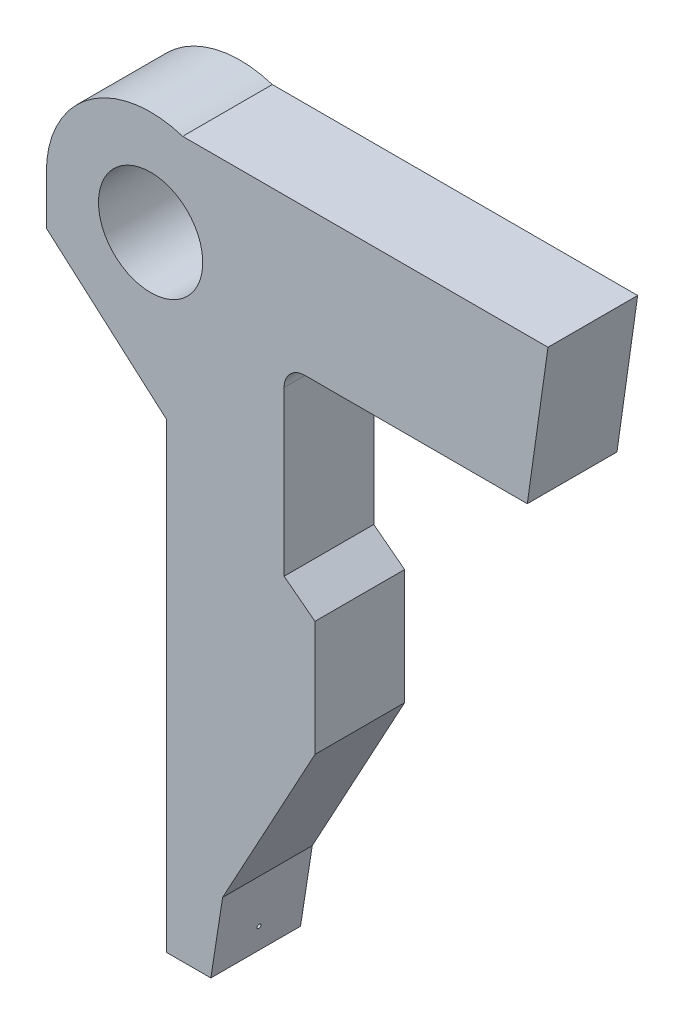
ISO-10303-21;
HEADER;
FILE_DESCRIPTION(('STEP AP214'),'2;1');
FILE_NAME('part.step','',(''),(''),'','','');
FILE_SCHEMA(('AUTOMOTIVE_DESIGN { 1 0 10303 214 1 1 1 1 }'));
ENDSEC;
DATA;
#1=APPLICATION_CONTEXT('core data for automotive mechanical design processes');
#2=APPLICATION_PROTOCOL_DEFINITION('international standard','automotive_design',2000,#1);
#3=PRODUCT_CONTEXT('',#1,'mechanical');
#4=PRODUCT('Part','Part','',(#3));
#5=PRODUCT_RELATED_PRODUCT_CATEGORY('part','',(#4));
#6=PRODUCT_DEFINITION_FORMATION('','',#4);
#7=PRODUCT_DEFINITION_CONTEXT('part definition',#1,'design');
#8=PRODUCT_DEFINITION('design','',#6,#7);
#9=PRODUCT_DEFINITION_SHAPE('','',#8);
#10=(LENGTH_UNIT() NAMED_UNIT(*) SI_UNIT(.MILLI.,.METRE.));
#11=(NAMED_UNIT(*) PLANE_ANGLE_UNIT() SI_UNIT($,.RADIAN.));
#12=(NAMED_UNIT(*) SI_UNIT($,.STERADIAN.) SOLID_ANGLE_UNIT());
#13=UNCERTAINTY_MEASURE_WITH_UNIT(LENGTH_MEASURE(1.E-05),#10,'distance_accuracy_value','');
#14=(GEOMETRIC_REPRESENTATION_CONTEXT(3) GLOBAL_UNCERTAINTY_ASSIGNED_CONTEXT((#13)) GLOBAL_UNIT_ASSIGNED_CONTEXT((#10,
#11,#12)) REPRESENTATION_CONTEXT('',''));
#15=CARTESIAN_POINT('',(0.,0.,0.));
#16=DIRECTION('',(0.,0.,1.));
#17=DIRECTION('',(1.,0.,0.));
#18=AXIS2_PLACEMENT_3D('',#15,#16,#17);
#19=CARTESIAN_POINT('',(6.40208237027269,0.,4.3));
#20=DIRECTION('',(-1.,0.,0.));
#21=DIRECTION('',(0.,-1.,0.));
#22=AXIS2_PLACEMENT_3D('',#19,#20,#21);
#23=PLANE('',#22);
#24=DIRECTION('',(0.,1.,0.));
#25=VECTOR('',#24,1.);
#26=CARTESIAN_POINT('',(6.40208237027269,0.,0.));
#27=LINE('',#26,#25);
#28=CARTESIAN_POINT('',(6.40208237027269,-11.0792552576076,0.));
#29=VERTEX_POINT('',#28);
#30=CARTESIAN_POINT('',(6.40208237027269,-3.2376102121532,0.));
#31=VERTEX_POINT('',#30);
#32=EDGE_CURVE('E171',#29,#31,#27,.T.);
#33=ORIENTED_EDGE('',*,*,#32,.T.);
#34=DIRECTION('',(0.,0.,-1.));
#35=VECTOR('',#34,1.);
#36=CARTESIAN_POINT('',(6.40208237027269,-3.2376102121532,4.3));
#37=LINE('',#36,#35);
#38=CARTESIAN_POINT('',(6.40208237027269,-3.2376102121532,4.3));
#39=VERTEX_POINT('',#38);
#40=EDGE_CURVE('E11',#39,#31,#37,.T.);
#41=ORIENTED_EDGE('',*,*,#40,.F.);
#42=DIRECTION('',(0.,1.,0.));
#43=VECTOR('',#42,1.);
#44=CARTESIAN_POINT('',(6.40208237027269,0.,4.3));
#45=LINE('',#44,#43);
#46=CARTESIAN_POINT('',(6.40208237027269,-11.0792552576076,4.3));
#47=VERTEX_POINT('',#46);
#48=EDGE_CURVE('E201',#47,#39,#45,.T.);
#49=ORIENTED_EDGE('',*,*,#48,.F.);
#50=DIRECTION('',(0.,0.,-1.));
#51=VECTOR('',#50,1.);
#52=CARTESIAN_POINT('',(6.40208237027269,-11.0792552576076,4.3));
#53=LINE('',#52,#51);
#54=EDGE_CURVE('E170',#47,#29,#53,.T.);
#55=ORIENTED_EDGE('',*,*,#54,.T.);
#56=EDGE_LOOP('',(#33,#41,#49,#55));
#57=FACE_BOUND('',#56,.T.);
#58=ADVANCED_FACE('F35',(#57),#23,.F.);
#59=CARTESIAN_POINT('',(7.40208237027269,-3.2376102121532,4.3));
#60=DIRECTION('',(0.,0.,-1.));
#61=DIRECTION('',(-1.,0.,0.));
#62=AXIS2_PLACEMENT_3D('',#59,#60,#61);
#63=CYLINDRICAL_SURFACE('',#62,0.999999999999999);
#64=CARTESIAN_POINT('',(7.40208237027269,-3.2376102121532,0.));
#65=DIRECTION('',(0.,0.,1.));
#66=DIRECTION('',(1.,0.,0.));
#67=AXIS2_PLACEMENT_3D('',#64,#65,#66);
#68=CIRCLE('',#67,0.999999999999999);
#69=CARTESIAN_POINT('',(7.40208237027269,-2.2376102121532,0.));
#70=VERTEX_POINT('',#69);
#71=EDGE_CURVE('E174',#31,#70,#68,.F.);
#72=ORIENTED_EDGE('',*,*,#71,.T.);
#73=DIRECTION('',(0.,0.,-1.));
#74=VECTOR('',#73,1.);
#75=CARTESIAN_POINT('',(7.40208237027269,-2.2376102121532,4.3));
#76=LINE('',#75,#74);
#77=CARTESIAN_POINT('',(7.40208237027269,-2.2376102121532,4.3));
#78=VERTEX_POINT('',#77);
#79=EDGE_CURVE('E43',#78,#70,#76,.T.);
#80=ORIENTED_EDGE('',*,*,#79,.F.);
#81=CARTESIAN_POINT('',(7.40208237027269,-3.2376102121532,4.3));
#82=DIRECTION('',(0.,0.,1.));
#83=DIRECTION('',(1.,0.,0.));
#84=AXIS2_PLACEMENT_3D('',#81,#82,#83);
#85=CIRCLE('',#84,0.999999999999999);
#86=EDGE_CURVE('E112',#39,#78,#85,.F.);
#87=ORIENTED_EDGE('',*,*,#86,.F.);
#88=ORIENTED_EDGE('',*,*,#40,.T.);
#89=EDGE_LOOP('',(#72,#80,#87,#88));
#90=FACE_BOUND('',#89,.T.);
#91=ADVANCED_FACE('F291',(#90),#63,.F.);
#92=CARTESIAN_POINT('',(0.,-2.2376102121532,4.3));
#93=DIRECTION('',(0.,1.,0.));
#94=DIRECTION('',(-1.,0.,0.));
#95=AXIS2_PLACEMENT_3D('',#92,#93,#94);
#96=PLANE('',#95);
#97=DIRECTION('',(1.,0.,0.));
#98=VECTOR('',#97,1.);
#99=CARTESIAN_POINT('',(0.,-2.2376102121532,0.));
#100=LINE('',#99,#98);
#101=CARTESIAN_POINT('',(18.063612226188,-2.2376102121532,0.));
#102=VERTEX_POINT('',#101);
#103=EDGE_CURVE('E177',#70,#102,#100,.T.);
#104=ORIENTED_EDGE('',*,*,#103,.T.);
#105=DIRECTION('',(0.,0.,-1.));
#106=VECTOR('',#105,1.);
#107=CARTESIAN_POINT('',(18.063612226188,-2.2376102121532,4.3));
#108=LINE('',#107,#106);
#109=CARTESIAN_POINT('',(18.063612226188,-2.2376102121532,4.3));
#110=VERTEX_POINT('',#109);
#111=EDGE_CURVE('E226',#110,#102,#108,.T.);
#112=ORIENTED_EDGE('',*,*,#111,.F.);
#113=DIRECTION('',(1.,0.,0.));
#114=VECTOR('',#113,1.);
#115=CARTESIAN_POINT('',(0.,-2.2376102121532,4.3));
#116=LINE('',#115,#114);
#117=EDGE_CURVE('E234',#78,#110,#116,.T.);
#118=ORIENTED_EDGE('',*,*,#117,.F.);
#119=ORIENTED_EDGE('',*,*,#79,.T.);
#120=EDGE_LOOP('',(#104,#112,#118,#119));
#121=FACE_BOUND('',#120,.T.);
#122=ADVANCED_FACE('F232',(#121),#96,.F.);
#123=CARTESIAN_POINT('',(18.0184346235268,-2.55607840833381,4.3));
#124=DIRECTION('',(-0.990087364863809,0.140452874434947,0.));
#125=DIRECTION('',(-0.140452874434947,-0.990087364863809,0.));
#126=AXIS2_PLACEMENT_3D('',#123,#124,#125);
#127=PLANE('',#126);
#128=DIRECTION('',(0.140452874434947,0.990087364863809,0.));
#129=VECTOR('',#128,1.);
#130=CARTESIAN_POINT('',(18.0184346235268,-2.55607840833381,0.));
#131=LINE('',#130,#129);
#132=CARTESIAN_POINT('',(19.0560025989645,4.7579971974597,0.));
#133=VERTEX_POINT('',#132);
#134=EDGE_CURVE('E179',#102,#133,#131,.T.);
#135=ORIENTED_EDGE('',*,*,#134,.T.);
#136=DIRECTION('',(0.,0.,-1.));
#137=VECTOR('',#136,1.);
#138=CARTESIAN_POINT('',(19.0560025989645,4.7579971974597,4.3));
#139=LINE('',#138,#137);
#140=CARTESIAN_POINT('',(19.0560025989645,4.7579971974597,4.3));
#141=VERTEX_POINT('',#140);
#142=EDGE_CURVE('E223',#141,#133,#139,.T.);
#143=ORIENTED_EDGE('',*,*,#142,.F.);
#144=DIRECTION('',(0.140452874434947,0.990087364863809,0.));
#145=VECTOR('',#144,1.);
#146=CARTESIAN_POINT('',(18.0184346235268,-2.55607840833381,4.3));
#147=LINE('',#146,#145);
#148=EDGE_CURVE('E253',#110,#141,#147,.T.);
#149=ORIENTED_EDGE('',*,*,#148,.F.);
#150=ORIENTED_EDGE('',*,*,#111,.T.);
#151=EDGE_LOOP('',(#135,#143,#149,#150));
#152=FACE_BOUND('',#151,.T.);
#153=ADVANCED_FACE('F244',(#152),#127,.F.);
#154=CARTESIAN_POINT('',(0.,4.7579971974597,4.3));
#155=DIRECTION('',(0.,-1.,0.));
#156=DIRECTION('',(0.,0.,-1.));
#157=AXIS2_PLACEMENT_3D('',#154,#155,#156);
#158=PLANE('',#157);
#159=DIRECTION('',(-1.,0.,0.));
#160=VECTOR('',#159,1.);
#161=CARTESIAN_POINT('',(0.,4.7579971974597,0.));
#162=LINE('',#161,#160);
#163=CARTESIAN_POINT('',(1.53670513403374,4.7579971974597,0.));
#164=VERTEX_POINT('',#163);
#165=EDGE_CURVE('E181',#133,#164,#162,.T.);
#166=ORIENTED_EDGE('',*,*,#165,.T.);
#167=DIRECTION('',(0.,0.,-1.));
#168=VECTOR('',#167,1.);
#169=CARTESIAN_POINT('',(1.53670513403374,4.7579971974597,4.3));
#170=LINE('',#169,#168);
#171=CARTESIAN_POINT('',(1.53670513403374,4.7579971974597,4.3));
#172=VERTEX_POINT('',#171);
#173=EDGE_CURVE('E220',#172,#164,#170,.T.);
#174=ORIENTED_EDGE('',*,*,#173,.F.);
#175=DIRECTION('',(-1.,0.,0.));
#176=VECTOR('',#175,1.);
#177=CARTESIAN_POINT('',(0.,4.7579971974597,4.3));
#178=LINE('',#177,#176);
#179=EDGE_CURVE('E250',#141,#172,#178,.T.);
#180=ORIENTED_EDGE('',*,*,#179,.F.);
#181=ORIENTED_EDGE('',*,*,#142,.T.);
#182=EDGE_LOOP('',(#166,#174,#180,#181));
#183=FACE_BOUND('',#182,.T.);
#184=ADVANCED_FACE('F248',(#183),#158,.F.);
#185=CARTESIAN_POINT('',(0.,0.,4.3));
#186=DIRECTION('',(0.,0.,-1.));
#187=DIRECTION('',(-1.,0.,0.));
#188=AXIS2_PLACEMENT_3D('',#185,#186,#187);
#189=CYLINDRICAL_SURFACE('',#188,5.);
#190=CARTESIAN_POINT('',(0.,0.,0.));
#191=DIRECTION('',(0.,0.,1.));
#192=DIRECTION('',(1.,0.,0.));
#193=AXIS2_PLACEMENT_3D('',#190,#191,#192);
#194=CIRCLE('',#193,5.);
#195=CARTESIAN_POINT('',(-5.,0.,0.));
#196=VERTEX_POINT('',#195);
#197=EDGE_CURVE('E183',#164,#196,#194,.T.);
#198=ORIENTED_EDGE('',*,*,#197,.T.);
#199=DIRECTION('',(0.,0.,-1.));
#200=VECTOR('',#199,1.);
#201=CARTESIAN_POINT('',(-5.,0.,4.3));
#202=LINE('',#201,#200);
#203=CARTESIAN_POINT('',(-5.,0.,4.3));
#204=VERTEX_POINT('',#203);
#205=EDGE_CURVE('E217',#204,#196,#202,.T.);
#206=ORIENTED_EDGE('',*,*,#205,.F.);
#207=CARTESIAN_POINT('',(0.,0.,4.3));
#208=DIRECTION('',(0.,0.,1.));
#209=DIRECTION('',(1.,0.,0.));
#210=AXIS2_PLACEMENT_3D('',#207,#208,#209);
#211=CIRCLE('',#210,5.);
#212=EDGE_CURVE('E252',#172,#204,#211,.T.);
#213=ORIENTED_EDGE('',*,*,#212,.F.);
#214=ORIENTED_EDGE('',*,*,#173,.T.);
#215=EDGE_LOOP('',(#198,#206,#213,#214));
#216=FACE_BOUND('',#215,.T.);
#217=ADVANCED_FACE('F304',(#216),#189,.T.);
#218=CARTESIAN_POINT('',(-5.,0.,4.3));
#219=DIRECTION('',(1.,0.,0.));
#220=DIRECTION('',(0.,0.,-1.));
#221=AXIS2_PLACEMENT_3D('',#218,#219,#220);
#222=PLANE('',#221);
#223=DIRECTION('',(0.,-1.,0.));
#224=VECTOR('',#223,1.);
#225=CARTESIAN_POINT('',(-5.,0.,0.));
#226=LINE('',#225,#224);
#227=CARTESIAN_POINT('',(-5.,-2.32647439688253,0.));
#228=VERTEX_POINT('',#227);
#229=EDGE_CURVE('E185',#196,#228,#226,.T.);
#230=ORIENTED_EDGE('',*,*,#229,.T.);
#231=DIRECTION('',(0.,0.,-1.));
#232=VECTOR('',#231,1.);
#233=CARTESIAN_POINT('',(-5.,-2.32647439688253,4.3));
#234=LINE('',#233,#232);
#235=CARTESIAN_POINT('',(-5.,-2.32647439688253,4.3));
#236=VERTEX_POINT('',#235);
#237=EDGE_CURVE('E214',#236,#228,#234,.T.);
#238=ORIENTED_EDGE('',*,*,#237,.F.);
#239=DIRECTION('',(0.,-1.,0.));
#240=VECTOR('',#239,1.);
#241=CARTESIAN_POINT('',(-5.,0.,4.3));
#242=LINE('',#241,#240);
#243=EDGE_CURVE('E255',#204,#236,#242,.T.);
#244=ORIENTED_EDGE('',*,*,#243,.F.);
#245=ORIENTED_EDGE('',*,*,#205,.T.);
#246=EDGE_LOOP('',(#230,#238,#244,#245));
#247=FACE_BOUND('',#246,.T.);
#248=ADVANCED_FACE('F307',(#247),#222,.F.);
#249=CARTESIAN_POINT('',(-3.32960365921922,-3.79285286398016,4.3));
#250=DIRECTION('',(0.659722162079872,0.751509593325767,0.));
#251=DIRECTION('',(-0.751509593325767,0.659722162079872,0.));
#252=AXIS2_PLACEMENT_3D('',#249,#250,#251);
#253=PLANE('',#252);
#254=DIRECTION('',(0.751509593325767,-0.659722162079872,0.));
#255=VECTOR('',#254,1.);
#256=CARTESIAN_POINT('',(-3.32960365921922,-3.79285286398016,0.));
#257=LINE('',#256,#255);
#258=CARTESIAN_POINT('',(0.754164722411706,-7.3778403745722,0.));
#259=VERTEX_POINT('',#258);
#260=EDGE_CURVE('E187',#228,#259,#257,.T.);
#261=ORIENTED_EDGE('',*,*,#260,.T.);
#262=DIRECTION('',(0.,0.,-1.));
#263=VECTOR('',#262,1.);
#264=CARTESIAN_POINT('',(0.754164722411706,-7.3778403745722,4.3));
#265=LINE('',#264,#263);
#266=CARTESIAN_POINT('',(0.754164722411706,-7.3778403745722,4.3));
#267=VERTEX_POINT('',#266);
#268=EDGE_CURVE('E211',#267,#259,#265,.T.);
#269=ORIENTED_EDGE('',*,*,#268,.F.);
#270=DIRECTION('',(0.751509593325767,-0.659722162079872,0.));
#271=VECTOR('',#270,1.);
#272=CARTESIAN_POINT('',(-3.32960365921922,-3.79285286398016,4.3));
#273=LINE('',#272,#271);
#274=EDGE_CURVE('E261',#236,#267,#273,.T.);
#275=ORIENTED_EDGE('',*,*,#274,.F.);
#276=ORIENTED_EDGE('',*,*,#237,.T.);
#277=EDGE_LOOP('',(#261,#269,#275,#276));
#278=FACE_BOUND('',#277,.T.);
#279=ADVANCED_FACE('F311',(#278),#253,.F.);
#280=CARTESIAN_POINT('',(0.754164722411706,0.,4.3));
#281=DIRECTION('',(1.,0.,0.));
#282=DIRECTION('',(0.,0.,-1.));
#283=AXIS2_PLACEMENT_3D('',#280,#281,#282);
#284=PLANE('',#283);
#285=CARTESIAN_POINT('',(0.754164722411706,-27.0200129312189,2.17478024930434));
#286=DIRECTION('',(-1.,0.,0.));
#287=DIRECTION('',(0.,0.,1.));
#288=AXIS2_PLACEMENT_3D('',#285,#286,#287);
#289=CIRCLE('',#288,1.825);
#290=CARTESIAN_POINT('',(0.754164722411706,-27.0200129312189,3.99978024930434));
#291=VERTEX_POINT('',#290);
#292=EDGE_CURVE('E416',#291,#291,#289,.T.);
#293=ORIENTED_EDGE('',*,*,#292,.F.);
#294=EDGE_LOOP('',(#293));
#295=FACE_BOUND('',#294,.T.);
#296=DIRECTION('',(0.,-1.,0.));
#297=VECTOR('',#296,1.);
#298=CARTESIAN_POINT('',(0.754164722411706,0.,0.));
#299=LINE('',#298,#297);
#300=CARTESIAN_POINT('',(0.754164722411706,-29.5198901160511,0.));
#301=VERTEX_POINT('',#300);
#302=EDGE_CURVE('E189',#259,#301,#299,.T.);
#303=ORIENTED_EDGE('',*,*,#302,.T.);
#304=DIRECTION('',(0.,0.,-1.));
#305=VECTOR('',#304,1.);
#306=CARTESIAN_POINT('',(0.754164722411706,-29.5198901160511,4.3));
#307=LINE('',#306,#305);
#308=CARTESIAN_POINT('',(0.754164722411706,-29.5198901160511,4.3));
#309=VERTEX_POINT('',#308);
#310=EDGE_CURVE('E208',#309,#301,#307,.T.);
#311=ORIENTED_EDGE('',*,*,#310,.F.);
#312=DIRECTION('',(0.,-1.,0.));
#313=VECTOR('',#312,1.);
#314=CARTESIAN_POINT('',(0.754164722411706,0.,4.3));
#315=LINE('',#314,#313);
#316=EDGE_CURVE('E263',#267,#309,#315,.T.);
#317=ORIENTED_EDGE('',*,*,#316,.F.);
#318=ORIENTED_EDGE('',*,*,#268,.T.);
#319=EDGE_LOOP('',(#303,#311,#317,#318));
#320=FACE_BOUND('',#319,.T.);
#321=ADVANCED_FACE('F315',(#295,#320),#284,.F.);
#322=CARTESIAN_POINT('',(-2.39866646747301E-13,-29.519890116051,4.3));
#323=DIRECTION('',(0.,1.,0.));
#324=DIRECTION('',(-1.,0.,0.));
#325=AXIS2_PLACEMENT_3D('',#322,#323,#324);
#326=PLANE('',#325);
#327=DIRECTION('',(1.,0.,0.));
#328=VECTOR('',#327,1.);
#329=CARTESIAN_POINT('',(-2.39866646747301E-13,-29.519890116051,0.));
#330=LINE('',#329,#328);
#331=CARTESIAN_POINT('',(2.88905288160283,-29.5198901160511,0.));
#332=VERTEX_POINT('',#331);
#333=EDGE_CURVE('E191',#301,#332,#330,.T.);
#334=ORIENTED_EDGE('',*,*,#333,.T.);
#335=DIRECTION('',(0.,0.,-1.));
#336=VECTOR('',#335,1.);
#337=CARTESIAN_POINT('',(2.88905288160283,-29.5198901160511,4.3));
#338=LINE('',#337,#336);
#339=CARTESIAN_POINT('',(2.88905288160283,-29.5198901160511,4.3));
#340=VERTEX_POINT('',#339);
#341=EDGE_CURVE('E205',#340,#332,#338,.T.);
#342=ORIENTED_EDGE('',*,*,#341,.F.);
#343=DIRECTION('',(1.,0.,0.));
#344=VECTOR('',#343,1.);
#345=CARTESIAN_POINT('',(-2.39866646747301E-13,-29.519890116051,4.3));
#346=LINE('',#345,#344);
#347=EDGE_CURVE('E265',#309,#340,#346,.T.);
#348=ORIENTED_EDGE('',*,*,#347,.F.);
#349=ORIENTED_EDGE('',*,*,#310,.T.);
#350=EDGE_LOOP('',(#334,#342,#348,#349));
#351=FACE_BOUND('',#350,.T.);
#352=ADVANCED_FACE('F271',(#351),#326,.F.);
#353=CARTESIAN_POINT('',(7.29737212162931,-1.13324948681235,4.3));
#354=DIRECTION('',(-0.988155457698499,0.153456154717463,0.));
#355=DIRECTION('',(-0.153456154717463,-0.988155457698499,0.));
#356=AXIS2_PLACEMENT_3D('',#353,#354,#355);
#357=PLANE('',#356);
#358=CARTESIAN_POINT('',(3.07150609141411,-28.3450129312189,2.17478024930434));
#359=DIRECTION('',(-0.988155457698499,0.153456154717463,0.));
#360=DIRECTION('',(-0.153456154717463,-0.988155457698499,0.));
#361=AXIS2_PLACEMENT_3D('',#358,#359,#360);
#362=ELLIPSE('',#361,0.101198651711046,0.0999999999999997);
#363=CARTESIAN_POINT('',(3.05597653545995,-28.4450129312189,2.17478024930434));
#364=VERTEX_POINT('',#363);
#365=EDGE_CURVE('E415',#364,#364,#362,.F.);
#366=ORIENTED_EDGE('',*,*,#365,.F.);
#367=EDGE_LOOP('',(#366));
#368=FACE_BOUND('',#367,.T.);
#369=DIRECTION('',(0.153456154717463,0.988155457698499,0.));
#370=VECTOR('',#369,1.);
#371=CARTESIAN_POINT('',(7.29737212162931,-1.13324948681235,0.));
#372=LINE('',#371,#370);
#373=CARTESIAN_POINT('',(3.45262694445621,-25.8908484067027,0.));
#374=VERTEX_POINT('',#373);
#375=EDGE_CURVE('E193',#332,#374,#372,.T.);
#376=ORIENTED_EDGE('',*,*,#375,.T.);
#377=DIRECTION('',(0.,0.,-1.));
#378=VECTOR('',#377,1.);
#379=CARTESIAN_POINT('',(3.45262694445621,-25.8908484067027,4.3));
#380=LINE('',#379,#378);
#381=CARTESIAN_POINT('',(3.45262694445621,-25.8908484067027,4.3));
#382=VERTEX_POINT('',#381);
#383=EDGE_CURVE('E159',#382,#374,#380,.T.);
#384=ORIENTED_EDGE('',*,*,#383,.F.);
#385=DIRECTION('',(0.153456154717463,0.988155457698499,0.));
#386=VECTOR('',#385,1.);
#387=CARTESIAN_POINT('',(7.29737212162931,-1.13324948681235,4.3));
#388=LINE('',#387,#386);
#389=EDGE_CURVE('E150',#340,#382,#388,.T.);
#390=ORIENTED_EDGE('',*,*,#389,.F.);
#391=ORIENTED_EDGE('',*,*,#341,.T.);
#392=EDGE_LOOP('',(#376,#384,#390,#391));
#393=FACE_BOUND('',#392,.T.);
#394=ADVANCED_FACE('F275',(#368,#393),#357,.F.);
#395=CARTESIAN_POINT('',(13.5263332156528,-7.34866620752027,4.3));
#396=DIRECTION('',(-0.878695413301182,0.477382834466704,0.));
#397=DIRECTION('',(-0.477382834466704,-0.878695413301182,0.));
#398=AXIS2_PLACEMENT_3D('',#395,#396,#397);
#399=PLANE('',#398);
#400=DIRECTION('',(0.477382834466704,0.878695413301182,0.));
#401=VECTOR('',#400,1.);
#402=CARTESIAN_POINT('',(13.5263332156528,-7.34866620752027,0.));
#403=LINE('',#402,#401);
#404=CARTESIAN_POINT('',(7.88035743742888,-17.7409397912093,0.));
#405=VERTEX_POINT('',#404);
#406=EDGE_CURVE('E158',#374,#405,#403,.T.);
#407=ORIENTED_EDGE('',*,*,#406,.T.);
#408=DIRECTION('',(0.,0.,-1.));
#409=VECTOR('',#408,1.);
#410=CARTESIAN_POINT('',(7.88035743742888,-17.7409397912093,4.3));
#411=LINE('',#410,#409);
#412=CARTESIAN_POINT('',(7.88035743742888,-17.7409397912093,4.3));
#413=VERTEX_POINT('',#412);
#414=EDGE_CURVE('E155',#413,#405,#411,.T.);
#415=ORIENTED_EDGE('',*,*,#414,.F.);
#416=DIRECTION('',(0.477382834466704,0.878695413301182,0.));
#417=VECTOR('',#416,1.);
#418=CARTESIAN_POINT('',(13.5263332156528,-7.34866620752027,4.3));
#419=LINE('',#418,#417);
#420=EDGE_CURVE('E143',#382,#413,#419,.T.);
#421=ORIENTED_EDGE('',*,*,#420,.F.);
#422=ORIENTED_EDGE('',*,*,#383,.T.);
#423=EDGE_LOOP('',(#407,#415,#421,#422));
#424=FACE_BOUND('',#423,.T.);
#425=ADVANCED_FACE('F156',(#424),#399,.F.);
#426=CARTESIAN_POINT('',(7.88035743742888,0.,4.3));
#427=DIRECTION('',(-1.,0.,0.));
#428=DIRECTION('',(0.,0.,1.));
#429=AXIS2_PLACEMENT_3D('',#426,#427,#428);
#430=PLANE('',#429);
#431=DIRECTION('',(0.,1.,0.));
#432=VECTOR('',#431,1.);
#433=CARTESIAN_POINT('',(7.88035743742888,0.,0.));
#434=LINE('',#433,#432);
#435=CARTESIAN_POINT('',(7.88035743742888,-12.211059605899,0.));
#436=VERTEX_POINT('',#435);
#437=EDGE_CURVE('E98',#405,#436,#434,.T.);
#438=ORIENTED_EDGE('',*,*,#437,.T.);
#439=DIRECTION('',(0.,0.,-1.));
#440=VECTOR('',#439,1.);
#441=CARTESIAN_POINT('',(7.88035743742888,-12.211059605899,4.3));
#442=LINE('',#441,#440);
#443=CARTESIAN_POINT('',(7.88035743742888,-12.211059605899,4.3));
#444=VERTEX_POINT('',#443);
#445=EDGE_CURVE('E160',#444,#436,#442,.T.);
#446=ORIENTED_EDGE('',*,*,#445,.F.);
#447=DIRECTION('',(0.,1.,0.));
#448=VECTOR('',#447,1.);
#449=CARTESIAN_POINT('',(7.88035743742888,0.,4.3));
#450=LINE('',#449,#448);
#451=EDGE_CURVE('E148',#413,#444,#450,.T.);
#452=ORIENTED_EDGE('',*,*,#451,.F.);
#453=ORIENTED_EDGE('',*,*,#414,.T.);
#454=EDGE_LOOP('',(#438,#446,#452,#453));
#455=FACE_BOUND('',#454,.T.);
#456=ADVANCED_FACE('F162',(#455),#430,.F.);
#457=CARTESIAN_POINT('',(-2.98186004568765,-3.89467434538796,4.3));
#458=DIRECTION('',(-0.607910502716912,-0.794005554569029,0.));
#459=DIRECTION('',(0.794005554569029,-0.607910502716912,0.));
#460=AXIS2_PLACEMENT_3D('',#457,#458,#459);
#461=PLANE('',#460);
#462=DIRECTION('',(-0.794005554569029,0.607910502716912,0.));
#463=VECTOR('',#462,1.);
#464=CARTESIAN_POINT('',(-2.98186004568765,-3.89467434538796,0.));
#465=LINE('',#464,#463);
#466=EDGE_CURVE('E104',#436,#29,#465,.T.);
#467=ORIENTED_EDGE('',*,*,#466,.T.);
#468=ORIENTED_EDGE('',*,*,#54,.F.);
#469=DIRECTION('',(-0.794005554569029,0.607910502716912,0.));
#470=VECTOR('',#469,1.);
#471=CARTESIAN_POINT('',(-2.98186004568765,-3.89467434538796,4.3));
#472=LINE('',#471,#470);
#473=EDGE_CURVE('E51',#444,#47,#472,.T.);
#474=ORIENTED_EDGE('',*,*,#473,.F.);
#475=ORIENTED_EDGE('',*,*,#445,.T.);
#476=EDGE_LOOP('',(#467,#468,#474,#475));
#477=FACE_BOUND('',#476,.T.);
#478=ADVANCED_FACE('F279',(#477),#461,.F.);
#479=CARTESIAN_POINT('',(0.,0.,4.3));
#480=DIRECTION('',(0.,0.,-1.));
#481=DIRECTION('',(-1.,0.,0.));
#482=AXIS2_PLACEMENT_3D('',#479,#480,#481);
#483=CYLINDRICAL_SURFACE('',#482,2.5);
#484=CARTESIAN_POINT('',(0.,0.,4.3));
#485=DIRECTION('',(0.,0.,1.));
#486=DIRECTION('',(1.,0.,0.));
#487=AXIS2_PLACEMENT_3D('',#484,#485,#486);
#488=CIRCLE('',#487,2.5);
#489=CARTESIAN_POINT('',(-2.5,0.,4.3));
#490=VERTEX_POINT('',#489);
#491=EDGE_CURVE('E164',#490,#490,#488,.T.);
#492=CARTESIAN_POINT('',(0.,0.,0.));
#493=DIRECTION('',(0.,0.,1.));
#494=DIRECTION('',(1.,0.,0.));
#495=AXIS2_PLACEMENT_3D('',#492,#493,#494);
#496=CIRCLE('',#495,2.5);
#497=CARTESIAN_POINT('',(-2.5,0.,0.));
#498=VERTEX_POINT('',#497);
#499=EDGE_CURVE('E198',#498,#498,#496,.T.);
#500=CARTESIAN_POINT('',(-2.5,0.,4.3));
#501=CARTESIAN_POINT('',(-2.5,0.,4.25520833333333));
#502=CARTESIAN_POINT('',(-2.5,0.,4.21041666666667));
#503=CARTESIAN_POINT('',(-2.5,0.,4.12083333333333));
#504=CARTESIAN_POINT('',(-2.5,0.,4.07604166666667));
#505=CARTESIAN_POINT('',(-2.5,0.,3.98645833333333));
#506=CARTESIAN_POINT('',(-2.5,0.,3.94166666666667));
#507=CARTESIAN_POINT('',(-2.5,0.,3.85208333333333));
#508=CARTESIAN_POINT('',(-2.5,0.,3.80729166666667));
#509=CARTESIAN_POINT('',(-2.5,0.,3.71770833333333));
#510=CARTESIAN_POINT('',(-2.5,0.,3.67291666666667));
#511=CARTESIAN_POINT('',(-2.5,0.,3.58333333333333));
#512=CARTESIAN_POINT('',(-2.5,0.,3.53854166666667));
#513=CARTESIAN_POINT('',(-2.5,0.,3.44895833333333));
#514=CARTESIAN_POINT('',(-2.5,0.,3.40416666666667));
#515=CARTESIAN_POINT('',(-2.5,0.,3.31458333333333));
#516=CARTESIAN_POINT('',(-2.5,0.,3.26979166666667));
#517=CARTESIAN_POINT('',(-2.5,0.,3.18020833333333));
#518=CARTESIAN_POINT('',(-2.5,0.,3.13541666666667));
#519=CARTESIAN_POINT('',(-2.5,0.,3.04583333333333));
#520=CARTESIAN_POINT('',(-2.5,0.,3.00104166666667));
#521=CARTESIAN_POINT('',(-2.5,0.,2.91145833333333));
#522=CARTESIAN_POINT('',(-2.5,0.,2.86666666666667));
#523=CARTESIAN_POINT('',(-2.5,0.,2.77708333333333));
#524=CARTESIAN_POINT('',(-2.5,0.,2.73229166666667));
#525=CARTESIAN_POINT('',(-2.5,0.,2.64270833333333));
#526=CARTESIAN_POINT('',(-2.5,0.,2.59791666666667));
#527=CARTESIAN_POINT('',(-2.5,0.,2.50833333333333));
#528=CARTESIAN_POINT('',(-2.5,0.,2.46354166666667));
#529=CARTESIAN_POINT('',(-2.5,0.,2.37395833333333));
#530=CARTESIAN_POINT('',(-2.5,0.,2.32916666666667));
#531=CARTESIAN_POINT('',(-2.5,0.,2.23958333333333));
#532=CARTESIAN_POINT('',(-2.5,0.,2.19479166666667));
#533=CARTESIAN_POINT('',(-2.5,0.,2.10520833333333));
#534=CARTESIAN_POINT('',(-2.5,0.,2.06041666666667));
#535=CARTESIAN_POINT('',(-2.5,0.,1.97083333333333));
#536=CARTESIAN_POINT('',(-2.5,0.,1.92604166666667));
#537=CARTESIAN_POINT('',(-2.5,0.,1.83645833333333));
#538=CARTESIAN_POINT('',(-2.5,0.,1.79166666666667));
#539=CARTESIAN_POINT('',(-2.5,0.,1.70208333333333));
#540=CARTESIAN_POINT('',(-2.5,0.,1.65729166666667));
#541=CARTESIAN_POINT('',(-2.5,0.,1.56770833333333));
#542=CARTESIAN_POINT('',(-2.5,0.,1.52291666666667));
#543=CARTESIAN_POINT('',(-2.5,0.,1.43333333333333));
#544=CARTESIAN_POINT('',(-2.5,0.,1.38854166666667));
#545=CARTESIAN_POINT('',(-2.5,0.,1.29895833333333));
#546=CARTESIAN_POINT('',(-2.5,0.,1.25416666666667));
#547=CARTESIAN_POINT('',(-2.5,0.,1.16458333333333));
#548=CARTESIAN_POINT('',(-2.5,0.,1.11979166666667));
#549=CARTESIAN_POINT('',(-2.5,0.,1.03020833333333));
#550=CARTESIAN_POINT('',(-2.5,0.,0.985416666666666));
#551=CARTESIAN_POINT('',(-2.5,0.,0.895833333333333));
#552=CARTESIAN_POINT('',(-2.5,0.,0.851041666666666));
#553=CARTESIAN_POINT('',(-2.5,0.,0.761458333333333));
#554=CARTESIAN_POINT('',(-2.5,0.,0.716666666666666));
#555=CARTESIAN_POINT('',(-2.5,0.,0.627083333333333));
#556=CARTESIAN_POINT('',(-2.5,0.,0.582291666666666));
#557=CARTESIAN_POINT('',(-2.5,0.,0.492708333333333));
#558=CARTESIAN_POINT('',(-2.5,0.,0.447916666666666));
#559=CARTESIAN_POINT('',(-2.5,0.,0.358333333333333));
#560=CARTESIAN_POINT('',(-2.5,0.,0.313541666666666));
#561=CARTESIAN_POINT('',(-2.5,0.,0.223958333333332));
#562=CARTESIAN_POINT('',(-2.5,0.,0.179166666666666));
#563=CARTESIAN_POINT('',(-2.5,0.,0.0895833333333324));
#564=CARTESIAN_POINT('',(-2.5,0.,0.0447916666666658));
#565=CARTESIAN_POINT('',(-2.5,0.,0.));
#566=B_SPLINE_CURVE_WITH_KNOTS('',3,(#500,#501,#502,#503,#504,#505,#506,#507,#508,#509,#510,
#511,#512,#513,#514,#515,#516,#517,#518,#519,#520,#521,#522,#523,#524,#525,#526,#527,#528,#529,
#530,#531,#532,#533,#534,#535,#536,#537,#538,#539,#540,#541,#542,#543,#544,#545,#546,#547,#548,
#549,#550,#551,#552,#553,#554,#555,#556,#557,#558,#559,#560,#561,#562,#563,#564,#565),
.UNSPECIFIED.,.F.,.F.,(4,2,2,2,2,2,2,2,2,2,2,2,2,2,2,2,2,2,2,2,2,2,2,2,2,2,2,2,2,2,2,2,4),(0.,
0.134375,0.26875,0.403124999999999,0.5375,0.671875,0.80625,0.940625,1.075,1.209375,1.34375,
1.478125,1.6125,1.746875,1.88125,2.015625,2.15,2.284375,2.41875,2.553125,2.6875,2.821875,
2.95625,3.090625,3.225,3.359375,3.49375,3.628125,3.7625,3.896875,4.03125,4.165625,4.3),.UNSPECIFIED.);
#567=EDGE_CURVE('BSEAM281',#490,#498,#566,.T.);
#568=ORIENTED_EDGE('',*,*,#491,.T.);
#569=ORIENTED_EDGE('',*,*,#499,.F.);
#570=ORIENTED_EDGE('',*,*,#567,.T.);
#571=ORIENTED_EDGE('',*,*,#567,.F.);
#572=EDGE_LOOP('',(#568,#570,#569,#571));
#573=FACE_BOUND('',#572,.T.);
#574=ADVANCED_FACE('F281',(#573),#483,.F.);
#575=CARTESIAN_POINT('',(0.,0.,4.3));
#576=DIRECTION('',(0.,0.,1.));
#577=DIRECTION('',(1.,0.,0.));
#578=AXIS2_PLACEMENT_3D('',#575,#576,#577);
#579=PLANE('',#578);
#580=ORIENTED_EDGE('',*,*,#48,.T.);
#581=ORIENTED_EDGE('',*,*,#86,.T.);
#582=ORIENTED_EDGE('',*,*,#117,.T.);
#583=ORIENTED_EDGE('',*,*,#148,.T.);
#584=ORIENTED_EDGE('',*,*,#179,.T.);
#585=ORIENTED_EDGE('',*,*,#212,.T.);
#586=ORIENTED_EDGE('',*,*,#243,.T.);
#587=ORIENTED_EDGE('',*,*,#274,.T.);
#588=ORIENTED_EDGE('',*,*,#316,.T.);
#589=ORIENTED_EDGE('',*,*,#347,.T.);
#590=ORIENTED_EDGE('',*,*,#389,.T.);
#591=ORIENTED_EDGE('',*,*,#420,.T.);
#592=ORIENTED_EDGE('',*,*,#451,.T.);
#593=ORIENTED_EDGE('',*,*,#473,.T.);
#594=EDGE_LOOP('',(#580,#581,#582,#583,#584,#585,#586,#587,#588,#589,#590,#591,#592,#593));
#595=FACE_BOUND('',#594,.T.);
#596=ORIENTED_EDGE('',*,*,#491,.F.);
#597=EDGE_LOOP('',(#596));
#598=FACE_BOUND('',#597,.T.);
#599=ADVANCED_FACE('F145',(#595,#598),#579,.T.);
#600=CARTESIAN_POINT('',(0.,0.,0.));
#601=DIRECTION('',(0.,0.,1.));
#602=DIRECTION('',(1.,0.,0.));
#603=AXIS2_PLACEMENT_3D('',#600,#601,#602);
#604=PLANE('',#603);
#605=ORIENTED_EDGE('',*,*,#32,.F.);
#606=ORIENTED_EDGE('',*,*,#466,.F.);
#607=ORIENTED_EDGE('',*,*,#437,.F.);
#608=ORIENTED_EDGE('',*,*,#406,.F.);
#609=ORIENTED_EDGE('',*,*,#375,.F.);
#610=ORIENTED_EDGE('',*,*,#333,.F.);
#611=ORIENTED_EDGE('',*,*,#302,.F.);
#612=ORIENTED_EDGE('',*,*,#260,.F.);
#613=ORIENTED_EDGE('',*,*,#229,.F.);
#614=ORIENTED_EDGE('',*,*,#197,.F.);
#615=ORIENTED_EDGE('',*,*,#165,.F.);
#616=ORIENTED_EDGE('',*,*,#134,.F.);
#617=ORIENTED_EDGE('',*,*,#103,.F.);
#618=ORIENTED_EDGE('',*,*,#71,.F.);
#619=EDGE_LOOP('',(#605,#606,#607,#608,#609,#610,#611,#612,#613,#614,#615,#616,#617,#618));
#620=FACE_BOUND('',#619,.T.);
#621=ORIENTED_EDGE('',*,*,#499,.T.);
#622=EDGE_LOOP('',(#621));
#623=FACE_BOUND('',#622,.T.);
#624=ADVANCED_FACE('F238',(#620,#623),#604,.F.);
#625=CARTESIAN_POINT('',(2.55416472241171,-27.0200129312189,2.17478024930434));
#626=DIRECTION('',(-1.,0.,0.));
#627=DIRECTION('',(0.,0.,1.));
#628=AXIS2_PLACEMENT_3D('',#625,#626,#627);
#629=CYLINDRICAL_SURFACE('',#628,1.825);
#630=CARTESIAN_POINT('',(2.55416472241171,-27.0200129312189,2.17478024930434));
#631=DIRECTION('',(-1.,0.,0.));
#632=DIRECTION('',(0.,0.,1.));
#633=AXIS2_PLACEMENT_3D('',#630,#631,#632);
#634=CIRCLE('',#633,1.825);
#635=CARTESIAN_POINT('',(2.55416472241171,-27.0200129312189,3.99978024930434));
#636=VERTEX_POINT('',#635);
#637=EDGE_CURVE('E175',#636,#636,#634,.T.);
#638=ORIENTED_EDGE('',*,*,#637,.F.);
#639=EDGE_LOOP('',(#638));
#640=FACE_BOUND('',#639,.T.);
#641=ORIENTED_EDGE('',*,*,#292,.T.);
#642=EDGE_LOOP('',(#641));
#643=FACE_BOUND('',#642,.T.);
#644=ADVANCED_FACE('F364',(#640,#643),#629,.F.);
#645=CARTESIAN_POINT('',(2.55416472241171,-27.0200129312189,2.17478024930434));
#646=DIRECTION('',(-1.,0.,0.));
#647=DIRECTION('',(0.,0.,1.));
#648=AXIS2_PLACEMENT_3D('',#645,#646,#647);
#649=PLANE('',#648);
#650=CARTESIAN_POINT('',(2.55416472241171,-28.3450129312189,2.17478024930434));
#651=DIRECTION('',(-1.,0.,0.));
#652=DIRECTION('',(0.,0.,1.));
#653=AXIS2_PLACEMENT_3D('',#650,#651,#652);
#654=CIRCLE('',#653,0.0999999999999997);
#655=CARTESIAN_POINT('',(2.55416472241171,-28.3450129312189,2.27478024930434));
#656=VERTEX_POINT('',#655);
#657=EDGE_CURVE('E412',#656,#656,#654,.T.);
#658=ORIENTED_EDGE('',*,*,#657,.F.);
#659=EDGE_LOOP('',(#658));
#660=FACE_BOUND('',#659,.T.);
#661=ORIENTED_EDGE('',*,*,#637,.T.);
#662=EDGE_LOOP('',(#661));
#663=FACE_BOUND('',#662,.T.);
#664=ADVANCED_FACE('F380',(#660,#663),#649,.T.);
#665=CARTESIAN_POINT('',(19.0570025989645,-28.3450129312189,2.17478024930434));
#666=DIRECTION('',(-1.,0.,0.));
#667=DIRECTION('',(0.,0.,1.));
#668=AXIS2_PLACEMENT_3D('',#665,#666,#667);
#669=CYLINDRICAL_SURFACE('',#668,0.0999999999999997);
#670=ORIENTED_EDGE('',*,*,#657,.T.);
#671=EDGE_LOOP('',(#670));
#672=FACE_BOUND('',#671,.T.);
#673=ORIENTED_EDGE('',*,*,#365,.T.);
#674=EDGE_LOOP('',(#673));
#675=FACE_BOUND('',#674,.T.);
#676=ADVANCED_FACE('F395',(#672,#675),#669,.F.);
#677=CLOSED_SHELL('',(#58,#91,#122,#153,#184,#217,#248,#279,#321,#352,#394,#425,#456,#478,#574,
#599,#624,#644,#664,#676));
#678=MANIFOLD_SOLID_BREP('B2',#677);
#679=ADVANCED_BREP_SHAPE_REPRESENTATION('',(#18,#678),#14);
#680=SHAPE_DEFINITION_REPRESENTATION(#9,#679);
ENDSEC;
END-ISO-10303-21;
